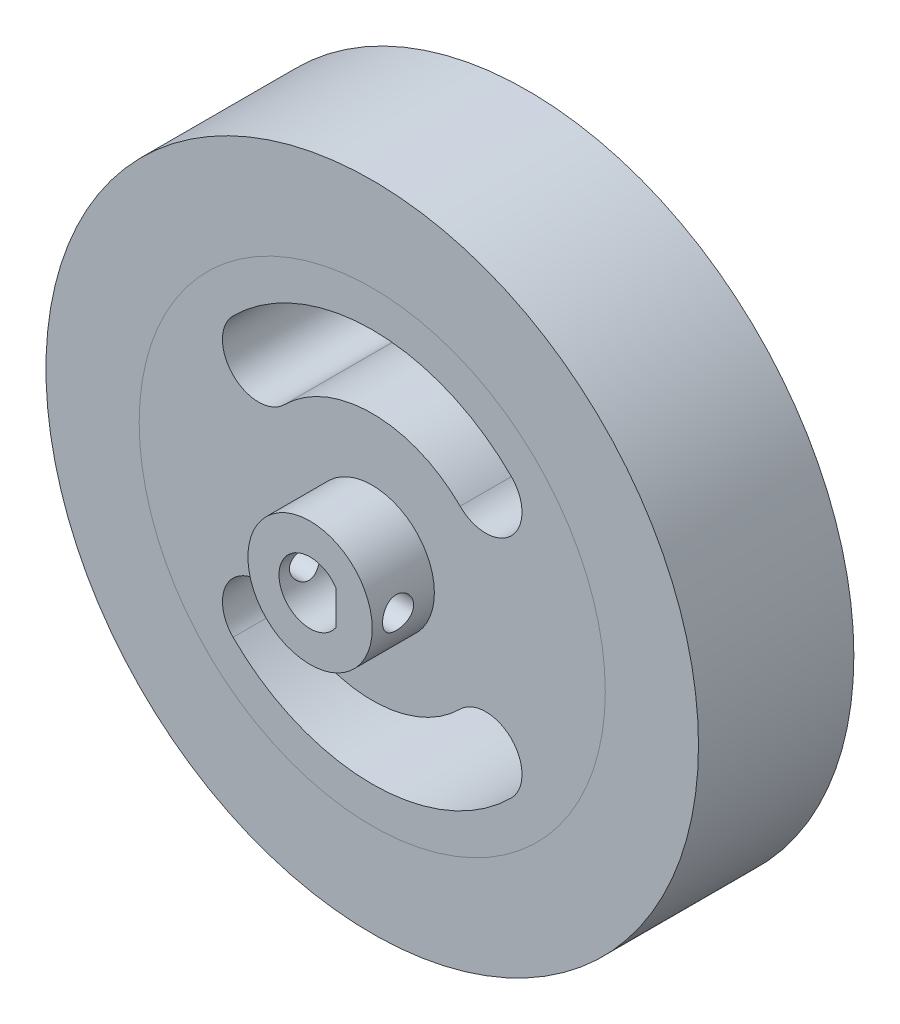
ISO-10303-21;
HEADER;
FILE_DESCRIPTION(('STEP AP214'),'2;1');
FILE_NAME('part.step','',(''),(''),'','','');
FILE_SCHEMA(('AUTOMOTIVE_DESIGN { 1 0 10303 214 1 1 1 1 }'));
ENDSEC;
DATA;
#1=APPLICATION_CONTEXT('core data for automotive mechanical design processes');
#2=APPLICATION_PROTOCOL_DEFINITION('international standard','automotive_design',2000,#1);
#3=PRODUCT_CONTEXT('',#1,'mechanical');
#4=PRODUCT('Part','Part','',(#3));
#5=PRODUCT_RELATED_PRODUCT_CATEGORY('part','',(#4));
#6=PRODUCT_DEFINITION_FORMATION('','',#4);
#7=PRODUCT_DEFINITION_CONTEXT('part definition',#1,'design');
#8=PRODUCT_DEFINITION('design','',#6,#7);
#9=PRODUCT_DEFINITION_SHAPE('','',#8);
#10=(LENGTH_UNIT() NAMED_UNIT(*) SI_UNIT(.MILLI.,.METRE.));
#11=(NAMED_UNIT(*) PLANE_ANGLE_UNIT() SI_UNIT($,.RADIAN.));
#12=(NAMED_UNIT(*) SI_UNIT($,.STERADIAN.) SOLID_ANGLE_UNIT());
#13=UNCERTAINTY_MEASURE_WITH_UNIT(LENGTH_MEASURE(1.E-05),#10,'distance_accuracy_value','');
#14=(GEOMETRIC_REPRESENTATION_CONTEXT(3) GLOBAL_UNCERTAINTY_ASSIGNED_CONTEXT((#13)) GLOBAL_UNIT_ASSIGNED_CONTEXT((#10,
#11,#12)) REPRESENTATION_CONTEXT('',''));
#15=CARTESIAN_POINT('',(0.,0.,0.));
#16=DIRECTION('',(0.,0.,1.));
#17=DIRECTION('',(1.,0.,0.));
#18=AXIS2_PLACEMENT_3D('',#15,#16,#17);
#19=CARTESIAN_POINT('',(0.,0.,15.));
#20=DIRECTION('',(0.,0.,1.));
#21=DIRECTION('',(1.,0.,0.));
#22=AXIS2_PLACEMENT_3D('',#19,#20,#21);
#23=PLANE('',#22);
#24=CARTESIAN_POINT('',(0.,0.,15.));
#25=DIRECTION('',(0.,0.,1.));
#26=DIRECTION('',(1.,0.,0.));
#27=AXIS2_PLACEMENT_3D('',#24,#25,#26);
#28=CIRCLE('',#27,31.5);
#29=CARTESIAN_POINT('',(31.5,0.,15.));
#30=VERTEX_POINT('',#29);
#31=EDGE_CURVE('E244',#30,#30,#28,.T.);
#32=ORIENTED_EDGE('',*,*,#31,.T.);
#33=EDGE_LOOP('',(#32));
#34=FACE_BOUND('',#33,.T.);
#35=CARTESIAN_POINT('',(0.,0.,15.));
#36=DIRECTION('',(0.,0.,1.));
#37=DIRECTION('',(1.,0.,0.));
#38=AXIS2_PLACEMENT_3D('',#35,#36,#37);
#39=CIRCLE('',#38,22.5);
#40=CARTESIAN_POINT('',(22.5,0.,15.));
#41=VERTEX_POINT('',#40);
#42=EDGE_CURVE('E11',#41,#41,#39,.F.);
#43=ORIENTED_EDGE('',*,*,#42,.T.);
#44=EDGE_LOOP('',(#43));
#45=FACE_BOUND('',#44,.T.);
#46=ADVANCED_FACE('F38',(#34,#45),#23,.T.);
#47=CARTESIAN_POINT('',(0.,0.,0.));
#48=DIRECTION('',(0.,0.,1.));
#49=DIRECTION('',(1.,0.,0.));
#50=AXIS2_PLACEMENT_3D('',#47,#48,#49);
#51=PLANE('',#50);
#52=CARTESIAN_POINT('',(0.,0.,0.));
#53=DIRECTION('',(0.,0.,1.));
#54=DIRECTION('',(1.,0.,0.));
#55=AXIS2_PLACEMENT_3D('',#52,#53,#54);
#56=CIRCLE('',#55,31.5);
#57=CARTESIAN_POINT('',(31.5,0.,0.));
#58=VERTEX_POINT('',#57);
#59=EDGE_CURVE('E262',#58,#58,#56,.T.);
#60=ORIENTED_EDGE('',*,*,#59,.F.);
#61=EDGE_LOOP('',(#60));
#62=FACE_BOUND('',#61,.T.);
#63=CARTESIAN_POINT('',(0.,0.,0.));
#64=DIRECTION('',(0.,0.,1.));
#65=DIRECTION('',(1.,0.,0.));
#66=AXIS2_PLACEMENT_3D('',#63,#64,#65);
#67=CIRCLE('',#66,22.5);
#68=CARTESIAN_POINT('',(22.5,0.,0.));
#69=VERTEX_POINT('',#68);
#70=EDGE_CURVE('E48',#69,#69,#67,.F.);
#71=ORIENTED_EDGE('',*,*,#70,.F.);
#72=EDGE_LOOP('',(#71));
#73=FACE_BOUND('',#72,.T.);
#74=ADVANCED_FACE('F228',(#62,#73),#51,.F.);
#75=CARTESIAN_POINT('',(10.9601551083915,10.9601551083915,15.));
#76=DIRECTION('',(0.,0.,1.));
#77=DIRECTION('',(1.,0.,0.));
#78=AXIS2_PLACEMENT_3D('',#75,#76,#77);
#79=CIRCLE('',#78,3.5);
#80=CARTESIAN_POINT('',(8.48528137423857,8.48528137423857,15.));
#81=VERTEX_POINT('',#80);
#82=CARTESIAN_POINT('',(13.4350288425444,13.4350288425444,15.));
#83=VERTEX_POINT('',#82);
#84=EDGE_CURVE('E122',#81,#83,#79,.T.);
#85=ORIENTED_EDGE('',*,*,#84,.F.);
#86=CARTESIAN_POINT('',(0.,0.,15.));
#87=DIRECTION('',(0.,0.,1.));
#88=DIRECTION('',(1.,0.,0.));
#89=AXIS2_PLACEMENT_3D('',#86,#87,#88);
#90=CIRCLE('',#89,12.);
#91=CARTESIAN_POINT('',(-8.4852813742383,8.48528137423884,15.));
#92=VERTEX_POINT('',#91);
#93=EDGE_CURVE('E183',#92,#81,#90,.F.);
#94=ORIENTED_EDGE('',*,*,#93,.F.);
#95=CARTESIAN_POINT('',(-10.9601551083911,10.9601551083918,15.));
#96=DIRECTION('',(0.,0.,1.));
#97=DIRECTION('',(1.,0.,0.));
#98=AXIS2_PLACEMENT_3D('',#95,#96,#97);
#99=CIRCLE('',#98,3.5);
#100=CARTESIAN_POINT('',(-13.435028842544,13.4350288425448,15.));
#101=VERTEX_POINT('',#100);
#102=EDGE_CURVE('E181',#101,#92,#99,.T.);
#103=ORIENTED_EDGE('',*,*,#102,.F.);
#104=CARTESIAN_POINT('',(0.,0.,15.));
#105=DIRECTION('',(0.,0.,1.));
#106=DIRECTION('',(1.,0.,0.));
#107=AXIS2_PLACEMENT_3D('',#104,#105,#106);
#108=CIRCLE('',#107,19.);
#109=EDGE_CURVE('E179',#83,#101,#108,.T.);
#110=ORIENTED_EDGE('',*,*,#109,.F.);
#111=EDGE_LOOP('',(#85,#94,#103,#110));
#112=FACE_BOUND('',#111,.T.);
#113=CARTESIAN_POINT('',(0.,0.,15.));
#114=DIRECTION('',(0.,0.,1.));
#115=DIRECTION('',(1.,0.,0.));
#116=AXIS2_PLACEMENT_3D('',#113,#114,#115);
#117=CIRCLE('',#116,12.);
#118=CARTESIAN_POINT('',(8.48528137423854,-8.4852813742386,15.));
#119=VERTEX_POINT('',#118);
#120=CARTESIAN_POINT('',(-8.48528137423833,-8.48528137423881,15.));
#121=VERTEX_POINT('',#120);
#122=EDGE_CURVE('E177',#119,#121,#117,.F.);
#123=ORIENTED_EDGE('',*,*,#122,.F.);
#124=CARTESIAN_POINT('',(10.9601551083915,-10.9601551083915,15.));
#125=DIRECTION('',(0.,0.,1.));
#126=DIRECTION('',(1.,0.,0.));
#127=AXIS2_PLACEMENT_3D('',#124,#125,#126);
#128=CIRCLE('',#127,3.5);
#129=CARTESIAN_POINT('',(13.4350288425444,-13.4350288425444,15.));
#130=VERTEX_POINT('',#129);
#131=EDGE_CURVE('E175',#130,#119,#128,.T.);
#132=ORIENTED_EDGE('',*,*,#131,.F.);
#133=CARTESIAN_POINT('',(0.,0.,15.));
#134=DIRECTION('',(0.,0.,1.));
#135=DIRECTION('',(1.,0.,0.));
#136=AXIS2_PLACEMENT_3D('',#133,#134,#135);
#137=CIRCLE('',#136,19.);
#138=CARTESIAN_POINT('',(-13.435028842544,-13.4350288425448,15.));
#139=VERTEX_POINT('',#138);
#140=EDGE_CURVE('E173',#139,#130,#137,.T.);
#141=ORIENTED_EDGE('',*,*,#140,.F.);
#142=CARTESIAN_POINT('',(-10.9601551083912,-10.9601551083918,15.));
#143=DIRECTION('',(0.,0.,1.));
#144=DIRECTION('',(1.,0.,0.));
#145=AXIS2_PLACEMENT_3D('',#142,#143,#144);
#146=CIRCLE('',#145,3.5);
#147=EDGE_CURVE('E149',#121,#139,#146,.T.);
#148=ORIENTED_EDGE('',*,*,#147,.F.);
#149=EDGE_LOOP('',(#123,#132,#141,#148));
#150=FACE_BOUND('',#149,.T.);
#151=ORIENTED_EDGE('',*,*,#42,.F.);
#152=EDGE_LOOP('',(#151));
#153=FACE_BOUND('',#152,.T.);
#154=CARTESIAN_POINT('',(0.,0.,15.));
#155=DIRECTION('',(0.,0.,1.));
#156=DIRECTION('',(1.,0.,0.));
#157=AXIS2_PLACEMENT_3D('',#154,#155,#156);
#158=CIRCLE('',#157,6.);
#159=CARTESIAN_POINT('',(6.,0.,15.));
#160=VERTEX_POINT('',#159);
#161=EDGE_CURVE('E250',#160,#160,#158,.T.);
#162=ORIENTED_EDGE('',*,*,#161,.F.);
#163=EDGE_LOOP('',(#162));
#164=FACE_BOUND('',#163,.T.);
#165=ADVANCED_FACE('F226',(#112,#150,#153,#164),#23,.T.);
#166=CARTESIAN_POINT('',(0.,0.,15.));
#167=DIRECTION('',(0.,0.,-1.));
#168=DIRECTION('',(-1.,0.,0.));
#169=AXIS2_PLACEMENT_3D('',#166,#167,#168);
#170=CYLINDRICAL_SURFACE('',#169,31.5);
#171=ORIENTED_EDGE('',*,*,#31,.F.);
#172=EDGE_LOOP('',(#171));
#173=FACE_BOUND('',#172,.T.);
#174=ORIENTED_EDGE('',*,*,#59,.T.);
#175=EDGE_LOOP('',(#174));
#176=FACE_BOUND('',#175,.T.);
#177=ADVANCED_FACE('F40',(#173,#176),#170,.T.);
#178=CARTESIAN_POINT('',(0.,0.,0.));
#179=DIRECTION('',(0.,0.,-1.));
#180=DIRECTION('',(1.,0.,0.));
#181=AXIS2_PLACEMENT_3D('',#178,#179,#180);
#182=CIRCLE('',#181,12.);
#183=CARTESIAN_POINT('',(-8.4852813742383,8.48528137423884,0.));
#184=VERTEX_POINT('',#183);
#185=CARTESIAN_POINT('',(8.48528137423857,8.48528137423857,0.));
#186=VERTEX_POINT('',#185);
#187=EDGE_CURVE('E125',#184,#186,#182,.T.);
#188=ORIENTED_EDGE('',*,*,#187,.T.);
#189=CARTESIAN_POINT('',(10.9601551083915,10.9601551083915,0.));
#190=DIRECTION('',(0.,0.,1.));
#191=DIRECTION('',(1.,0.,0.));
#192=AXIS2_PLACEMENT_3D('',#189,#190,#191);
#193=CIRCLE('',#192,3.5);
#194=CARTESIAN_POINT('',(13.4350288425444,13.4350288425444,0.));
#195=VERTEX_POINT('',#194);
#196=EDGE_CURVE('E119',#186,#195,#193,.T.);
#197=ORIENTED_EDGE('',*,*,#196,.T.);
#198=CARTESIAN_POINT('',(0.,0.,0.));
#199=DIRECTION('',(0.,0.,1.));
#200=DIRECTION('',(1.,0.,0.));
#201=AXIS2_PLACEMENT_3D('',#198,#199,#200);
#202=CIRCLE('',#201,19.);
#203=CARTESIAN_POINT('',(-13.435028842544,13.4350288425448,0.));
#204=VERTEX_POINT('',#203);
#205=EDGE_CURVE('E129',#195,#204,#202,.T.);
#206=ORIENTED_EDGE('',*,*,#205,.T.);
#207=CARTESIAN_POINT('',(-10.9601551083911,10.9601551083918,0.));
#208=DIRECTION('',(0.,0.,1.));
#209=DIRECTION('',(1.,0.,0.));
#210=AXIS2_PLACEMENT_3D('',#207,#208,#209);
#211=CIRCLE('',#210,3.5);
#212=EDGE_CURVE('E134',#204,#184,#211,.T.);
#213=ORIENTED_EDGE('',*,*,#212,.T.);
#214=EDGE_LOOP('',(#188,#197,#206,#213));
#215=FACE_BOUND('',#214,.T.);
#216=CARTESIAN_POINT('',(10.9601551083915,-10.9601551083915,0.));
#217=DIRECTION('',(0.,0.,1.));
#218=DIRECTION('',(-1.,0.,0.));
#219=AXIS2_PLACEMENT_3D('',#216,#217,#218);
#220=CIRCLE('',#219,3.5);
#221=CARTESIAN_POINT('',(13.4350288425444,-13.4350288425444,0.));
#222=VERTEX_POINT('',#221);
#223=CARTESIAN_POINT('',(8.48528137423854,-8.4852813742386,0.));
#224=VERTEX_POINT('',#223);
#225=EDGE_CURVE('E163',#222,#224,#220,.T.);
#226=ORIENTED_EDGE('',*,*,#225,.T.);
#227=CARTESIAN_POINT('',(0.,0.,0.));
#228=DIRECTION('',(0.,0.,-1.));
#229=DIRECTION('',(-1.,0.,0.));
#230=AXIS2_PLACEMENT_3D('',#227,#228,#229);
#231=CIRCLE('',#230,12.);
#232=CARTESIAN_POINT('',(-8.48528137423833,-8.48528137423881,0.));
#233=VERTEX_POINT('',#232);
#234=EDGE_CURVE('E154',#224,#233,#231,.T.);
#235=ORIENTED_EDGE('',*,*,#234,.T.);
#236=CARTESIAN_POINT('',(-10.9601551083912,-10.9601551083918,0.));
#237=DIRECTION('',(0.,0.,1.));
#238=DIRECTION('',(-1.,0.,0.));
#239=AXIS2_PLACEMENT_3D('',#236,#237,#238);
#240=CIRCLE('',#239,3.5);
#241=CARTESIAN_POINT('',(-13.435028842544,-13.4350288425448,0.));
#242=VERTEX_POINT('',#241);
#243=EDGE_CURVE('E157',#233,#242,#240,.T.);
#244=ORIENTED_EDGE('',*,*,#243,.T.);
#245=CARTESIAN_POINT('',(0.,0.,0.));
#246=DIRECTION('',(0.,0.,1.));
#247=DIRECTION('',(-1.,0.,0.));
#248=AXIS2_PLACEMENT_3D('',#245,#246,#247);
#249=CIRCLE('',#248,19.);
#250=EDGE_CURVE('E160',#242,#222,#249,.T.);
#251=ORIENTED_EDGE('',*,*,#250,.T.);
#252=EDGE_LOOP('',(#226,#235,#244,#251));
#253=FACE_BOUND('',#252,.T.);
#254=ORIENTED_EDGE('',*,*,#70,.T.);
#255=EDGE_LOOP('',(#254));
#256=FACE_BOUND('',#255,.T.);
#257=CARTESIAN_POINT('',(0.,0.,0.));
#258=DIRECTION('',(0.,0.,-1.));
#259=DIRECTION('',(-1.,0.,0.));
#260=AXIS2_PLACEMENT_3D('',#257,#258,#259);
#261=CIRCLE('',#260,3.);
#262=CARTESIAN_POINT('',(2.5,-1.6583123951777,0.));
#263=VERTEX_POINT('',#262);
#264=CARTESIAN_POINT('',(2.5,1.6583123951777,0.));
#265=VERTEX_POINT('',#264);
#266=EDGE_CURVE('E256',#263,#265,#261,.T.);
#267=ORIENTED_EDGE('',*,*,#266,.F.);
#268=DIRECTION('',(0.,1.,0.));
#269=VECTOR('',#268,1.);
#270=CARTESIAN_POINT('',(2.5,1.6583123951777,0.));
#271=LINE('',#270,#269);
#272=EDGE_CURVE('E258',#263,#265,#271,.T.);
#273=ORIENTED_EDGE('',*,*,#272,.T.);
#274=EDGE_LOOP('',(#267,#273));
#275=FACE_BOUND('',#274,.T.);
#276=ADVANCED_FACE('F136',(#215,#253,#256,#275),#51,.F.);
#277=CARTESIAN_POINT('',(0.,0.,15.));
#278=DIRECTION('',(0.,0.,-1.));
#279=DIRECTION('',(-1.,0.,0.));
#280=AXIS2_PLACEMENT_3D('',#277,#278,#279);
#281=CYLINDRICAL_SURFACE('',#280,3.);
#282=CARTESIAN_POINT('',(-3.,0.,17.));
#283=CARTESIAN_POINT('',(-2.99999570107562,-0.0788579444268503,17.0000049534758));
#284=CARTESIAN_POINT('',(-2.99685736529635,-0.157809899546344,17.0062551096816));
#285=CARTESIAN_POINT('',(-2.98461234055736,-0.313380352903344,17.0309793205123));
#286=CARTESIAN_POINT('',(-2.97549431743379,-0.389994130070444,17.0494765894967));
#287=CARTESIAN_POINT('',(-2.95224419105063,-0.538400317320673,17.0977907129249));
#288=CARTESIAN_POINT('',(-2.93813158766306,-0.610210204408719,17.127563576372));
#289=CARTESIAN_POINT('',(-2.90618664773642,-0.747708925209897,17.1973559320475));
#290=CARTESIAN_POINT('',(-2.88835460450288,-0.813398240985088,17.2373746163733));
#291=CARTESIAN_POINT('',(-2.84934387387093,-0.941261726642863,17.3292758742279));
#292=CARTESIAN_POINT('',(-2.82802798691306,-1.00298281668316,17.3817297188595));
#293=CARTESIAN_POINT('',(-2.78489955370115,-1.11716916730047,17.4957822188706));
#294=CARTESIAN_POINT('',(-2.76308664313552,-1.16962737466015,17.5573877776587));
#295=CARTESIAN_POINT('',(-2.71948426796021,-1.26787800067542,17.6937250242851));
#296=CARTESIAN_POINT('',(-2.69782780455198,-1.31283800332745,17.7691041475189));
#297=CARTESIAN_POINT('',(-2.65928968158481,-1.38925234033604,17.9275510039793));
#298=CARTESIAN_POINT('',(-2.64240461410484,-1.4207163224495,18.0106131930841));
#299=CARTESIAN_POINT('',(-2.61686800556713,-1.46719866328288,18.1769976581329));
#300=CARTESIAN_POINT('',(-2.6077840737557,-1.48308878562066,18.2600066781011));
#301=CARTESIAN_POINT('',(-2.59772834922792,-1.50064048996327,18.4279682566692));
#302=CARTESIAN_POINT('',(-2.59674854014932,-1.50231613255961,18.5129188113067));
#303=CARTESIAN_POINT('',(-2.60266395385873,-1.49203093075844,18.6714290364731));
#304=CARTESIAN_POINT('',(-2.6086314549302,-1.48167683930523,18.7451360468346));
#305=CARTESIAN_POINT('',(-2.62614343100775,-1.4504097735854,18.8895828640596));
#306=CARTESIAN_POINT('',(-2.63768968247664,-1.42949343584648,18.960321717958));
#307=CARTESIAN_POINT('',(-2.66531214619112,-1.37731467057901,19.0988436988485));
#308=CARTESIAN_POINT('',(-2.68148760995998,-1.34582260067399,19.1665195981787));
#309=CARTESIAN_POINT('',(-2.71655106422106,-1.27356253150201,19.295951438885));
#310=CARTESIAN_POINT('',(-2.73544027170286,-1.2327903657187,19.3577047034001));
#311=CARTESIAN_POINT('',(-2.77669736854929,-1.13709908236918,19.4817818791148));
#312=CARTESIAN_POINT('',(-2.79920265355119,-1.08104168755392,19.5431853103642));
#313=CARTESIAN_POINT('',(-2.84321434950611,-0.959333368112062,19.6561031278864));
#314=CARTESIAN_POINT('',(-2.86472027938201,-0.893677884861431,19.7076127880508));
#315=CARTESIAN_POINT('',(-2.90552980924446,-0.750774758747775,19.8015284915446));
#316=CARTESIAN_POINT('',(-2.92468476243011,-0.673130387399114,19.8434007086686));
#317=CARTESIAN_POINT('',(-2.95736821681863,-0.510699323233196,19.9131455435645));
#318=CARTESIAN_POINT('',(-2.9709011841533,-0.425918364397915,19.9410292775228));
#319=CARTESIAN_POINT('',(-2.98986500612153,-0.259149737491055,19.979713105575));
#320=CARTESIAN_POINT('',(-2.99587407451965,-0.17751229582249,19.9917368536202));
#321=CARTESIAN_POINT('',(-3.00109520188655,-0.0131693999240284,20.0021970967017));
#322=CARTESIAN_POINT('',(-3.00031048081978,0.0695355298048622,20.0006400284592));
#323=CARTESIAN_POINT('',(-2.99236788380152,0.226849457978979,19.9846899673719));
#324=CARTESIAN_POINT('',(-2.98570868532253,0.301589112074894,19.971301200905));
#325=CARTESIAN_POINT('',(-2.9673325697226,0.44761033845291,19.9336428921573));
#326=CARTESIAN_POINT('',(-2.95561509501618,0.51889152853663,19.9093721503198));
#327=CARTESIAN_POINT('',(-2.92776377120382,0.658332912674359,19.8500023003505));
#328=CARTESIAN_POINT('',(-2.91151322654446,0.726345595508706,19.8146134248256));
#329=CARTESIAN_POINT('',(-2.87615961476126,0.855692042548907,19.7343386965301));
#330=CARTESIAN_POINT('',(-2.85705533350407,0.917022944664887,19.6894487981069));
#331=CARTESIAN_POINT('',(-2.81562332004297,1.03765153393382,19.5863593620039));
#332=CARTESIAN_POINT('',(-2.79316327265249,1.09615811672854,19.5272856973323));
#333=CARTESIAN_POINT('',(-2.7489358741323,1.20278448167828,19.4001122730834));
#334=CARTESIAN_POINT('',(-2.72716901100071,1.25089707856781,19.3320063217281));
#335=CARTESIAN_POINT('',(-2.68576788309734,1.33756187171853,19.1845345187405));
#336=CARTESIAN_POINT('',(-2.66628794383591,1.37553824370037,19.1047831008583));
#337=CARTESIAN_POINT('',(-2.63361108441202,1.43712423890206,18.9387348986376));
#338=CARTESIAN_POINT('',(-2.62040607332625,1.46075237380053,18.8524467102997));
#339=CARTESIAN_POINT('',(-2.60342251538703,1.49079253120031,18.6846346656729));
#340=CARTESIAN_POINT('',(-2.59886075197597,1.49863949460818,18.6034486198471));
#341=CARTESIAN_POINT('',(-2.59748031962405,1.5010337315643,18.4408293992532));
#342=CARTESIAN_POINT('',(-2.60065829439585,1.49558676993486,18.3593963468932));
#343=CARTESIAN_POINT('',(-2.61356793076615,1.47288918838997,18.2067747476998));
#344=CARTESIAN_POINT('',(-2.62264641723988,1.45681247151455,18.1353492947829));
#345=CARTESIAN_POINT('',(-2.64556524281479,1.41476303733662,17.9962878208635));
#346=CARTESIAN_POINT('',(-2.65940711354503,1.38878713673988,17.928653026862));
#347=CARTESIAN_POINT('',(-2.69142795546803,1.32572361795085,17.7940627235202));
#348=CARTESIAN_POINT('',(-2.70983583593881,1.28800670672355,17.7274581472565));
#349=CARTESIAN_POINT('',(-2.74852997452291,1.20322645745609,17.6010881957281));
#350=CARTESIAN_POINT('',(-2.76881720693416,1.15615825686234,17.5413264042183));
#351=CARTESIAN_POINT('',(-2.81193484737138,1.04730498999206,17.422787026468));
#352=CARTESIAN_POINT('',(-2.83477474959942,0.984426634495894,17.3650113464746));
#353=CARTESIAN_POINT('',(-2.87816628389896,0.849232209349799,17.2606055248471));
#354=CARTESIAN_POINT('',(-2.89871667939293,0.776911084957799,17.2139813907951));
#355=CARTESIAN_POINT('',(-2.93547014349806,0.623897395174421,17.1331454559319));
#356=CARTESIAN_POINT('',(-2.95164144740899,0.543149255665098,17.0990237461453));
#357=CARTESIAN_POINT('',(-2.9775201194848,0.376113151707131,17.0452877483639));
#358=CARTESIAN_POINT('',(-2.98724585044602,0.289841699383651,17.0256322297914));
#359=CARTESIAN_POINT('',(-2.99543192870217,0.168902919736344,17.0091538833714));
#360=CARTESIAN_POINT('',(-2.99714048010376,0.135242819162348,17.0057260387005));
#361=CARTESIAN_POINT('',(-2.99942545465223,0.0677275977076379,17.0011480017289));
#362=CARTESIAN_POINT('',(-3.00000184655071,0.033872471469943,16.9999978722947));
#363=CARTESIAN_POINT('',(-3.,0.,17.));
#364=B_SPLINE_CURVE_WITH_KNOTS('',3,(#282,#283,#284,#285,#286,#287,#288,#289,#290,#291,#292,
#293,#294,#295,#296,#297,#298,#299,#300,#301,#302,#303,#304,#305,#306,#307,#308,#309,#310,#311,
#312,#313,#314,#315,#316,#317,#318,#319,#320,#321,#322,#323,#324,#325,#326,#327,#328,#329,#330,
#331,#332,#333,#334,#335,#336,#337,#338,#339,#340,#341,#342,#343,#344,#345,#346,#347,#348,#349,
#350,#351,#352,#353,#354,#355,#356,#357,#358,#359,#360,#361,#362,#363),.UNSPECIFIED.,.T.,.F.,(4,
2,2,2,2,2,2,2,2,2,2,2,2,2,2,2,2,2,2,2,2,2,2,2,2,2,2,2,2,2,2,2,2,2,2,2,2,2,2,2,4),(0.,
0.236436386130439,0.473322224563797,0.709293233238447,0.945245640872351,1.19547263807713,
1.44588935648105,1.71572589646129,1.98536921847421,2.23887018210344,2.49212035993531,
2.71508568613981,2.93812205888518,3.16635360252731,3.39468781890332,3.65197412000818,
3.9093830189803,4.17874533321661,4.4478932536842,4.69474935707019,4.94148846767214,
5.16910359759183,5.39674382446397,5.63089284041848,5.86514176122509,6.12239415966628,
6.37982382923148,6.64972023242589,6.91926767918176,7.1629396125457,7.40650589797017,
7.62686895373284,7.84730293182527,8.08254685170431,8.31791341715446,8.58187864135757,
8.84598575071869,9.1119602049529,9.37717362931724,9.47872920200876,9.58028757766599),.UNSPECIFIED.);
#365=CARTESIAN_POINT('',(-3.,0.,17.));
#366=VERTEX_POINT('',#365);
#367=EDGE_CURVE('E213',#366,#366,#364,.T.);
#368=ORIENTED_EDGE('',*,*,#367,.T.);
#369=EDGE_LOOP('',(#368));
#370=FACE_BOUND('',#369,.T.);
#371=ORIENTED_EDGE('',*,*,#266,.T.);
#372=DIRECTION('',(0.,0.,1.));
#373=VECTOR('',#372,1.);
#374=CARTESIAN_POINT('',(2.5,1.6583123951777,-3.35410196624969));
#375=LINE('',#374,#373);
#376=CARTESIAN_POINT('',(2.5,1.6583123951777,21.));
#377=VERTEX_POINT('',#376);
#378=EDGE_CURVE('E285',#265,#377,#375,.T.);
#379=ORIENTED_EDGE('',*,*,#378,.T.);
#380=CARTESIAN_POINT('',(0.,0.,21.));
#381=DIRECTION('',(0.,0.,1.));
#382=DIRECTION('',(1.,0.,0.));
#383=AXIS2_PLACEMENT_3D('',#380,#381,#382);
#384=CIRCLE('',#383,3.);
#385=CARTESIAN_POINT('',(2.5,-1.6583123951777,21.));
#386=VERTEX_POINT('',#385);
#387=EDGE_CURVE('E253',#377,#386,#384,.T.);
#388=ORIENTED_EDGE('',*,*,#387,.T.);
#389=DIRECTION('',(0.,0.,1.));
#390=VECTOR('',#389,1.);
#391=CARTESIAN_POINT('',(2.5,-1.6583123951777,-3.35410196624969));
#392=LINE('',#391,#390);
#393=EDGE_CURVE('E283',#263,#386,#392,.T.);
#394=ORIENTED_EDGE('',*,*,#393,.F.);
#395=EDGE_LOOP('',(#371,#379,#388,#394));
#396=FACE_BOUND('',#395,.T.);
#397=ADVANCED_FACE('F220',(#370,#396),#281,.F.);
#398=CARTESIAN_POINT('',(0.,0.,21.));
#399=DIRECTION('',(0.,0.,1.));
#400=DIRECTION('',(1.,0.,0.));
#401=AXIS2_PLACEMENT_3D('',#398,#399,#400);
#402=PLANE('',#401);
#403=CARTESIAN_POINT('',(0.,0.,21.));
#404=DIRECTION('',(0.,0.,1.));
#405=DIRECTION('',(1.,0.,0.));
#406=AXIS2_PLACEMENT_3D('',#403,#404,#405);
#407=CIRCLE('',#406,6.);
#408=CARTESIAN_POINT('',(6.,0.,21.));
#409=VERTEX_POINT('',#408);
#410=EDGE_CURVE('E252',#409,#409,#407,.T.);
#411=ORIENTED_EDGE('',*,*,#410,.T.);
#412=EDGE_LOOP('',(#411));
#413=FACE_BOUND('',#412,.T.);
#414=ORIENTED_EDGE('',*,*,#387,.F.);
#415=DIRECTION('',(0.,-1.,0.));
#416=VECTOR('',#415,1.);
#417=CARTESIAN_POINT('',(2.5,1.6583123951777,21.));
#418=LINE('',#417,#416);
#419=EDGE_CURVE('E218',#377,#386,#418,.T.);
#420=ORIENTED_EDGE('',*,*,#419,.T.);
#421=EDGE_LOOP('',(#414,#420));
#422=FACE_BOUND('',#421,.T.);
#423=ADVANCED_FACE('F224',(#413,#422),#402,.T.);
#424=CARTESIAN_POINT('',(0.,0.,21.));
#425=DIRECTION('',(0.,0.,-1.));
#426=DIRECTION('',(-1.,0.,0.));
#427=AXIS2_PLACEMENT_3D('',#424,#425,#426);
#428=CYLINDRICAL_SURFACE('',#427,6.);
#429=CARTESIAN_POINT('',(-6.,0.,20.));
#430=CARTESIAN_POINT('',(-5.99999859868013,-0.082876088669731,19.9999976742618));
#431=CARTESIAN_POINT('',(-5.99826578131828,-0.165778157830763,19.9931084492262));
#432=CARTESIAN_POINT('',(-5.99152113829892,-0.329206323770532,19.965774848693));
#433=CARTESIAN_POINT('',(-5.98650745419968,-0.409731046870739,19.9453227904622));
#434=CARTESIAN_POINT('',(-5.9737562633204,-0.566020872182577,19.8915607465379));
#435=CARTESIAN_POINT('',(-5.96602202842087,-0.641791563430003,19.8582662012847));
#436=CARTESIAN_POINT('',(-5.94865343807593,-0.786672131904426,19.7798186099552));
#437=CARTESIAN_POINT('',(-5.9390190185405,-0.855781784348759,19.7346651638811));
#438=CARTESIAN_POINT('',(-5.91867413591801,-0.98680192730092,19.6327992103458));
#439=CARTESIAN_POINT('',(-5.90794707148533,-1.04855569006107,19.5758884250408));
#440=CARTESIAN_POINT('',(-5.8867362011753,-1.1617489272033,19.4525477950911));
#441=CARTESIAN_POINT('',(-5.87625242288348,-1.21318723694913,19.3861168770535));
#442=CARTESIAN_POINT('',(-5.8565477569971,-1.30502654279903,19.2444047732626));
#443=CARTESIAN_POINT('',(-5.84734794470605,-1.34525221592536,19.1690067691896));
#444=CARTESIAN_POINT('',(-5.83149494812223,-1.41239690855053,19.0122515883416));
#445=CARTESIAN_POINT('',(-5.82484135672789,-1.43931805543933,18.9308953666742));
#446=CARTESIAN_POINT('',(-5.81500476717551,-1.47855483680429,18.7662565017975));
#447=CARTESIAN_POINT('',(-5.81175491075426,-1.49115226833334,18.6830451039502));
#448=CARTESIAN_POINT('',(-5.80889362537741,-1.50226177506785,18.515631430986));
#449=CARTESIAN_POINT('',(-5.80928160448644,-1.50077614181798,18.4314293193014));
#450=CARTESIAN_POINT('',(-5.81359205496618,-1.48398652463928,18.2665841922555));
#451=CARTESIAN_POINT('',(-5.81742863001879,-1.46901834019052,18.1859043785349));
#452=CARTESIAN_POINT('',(-5.82806709676484,-1.42622418690311,18.0282389490887));
#453=CARTESIAN_POINT('',(-5.83486919970696,-1.39839730206942,17.951253596971));
#454=CARTESIAN_POINT('',(-5.85075113904187,-1.33038947793715,17.8022619837479));
#455=CARTESIAN_POINT('',(-5.85985327469421,-1.29008666723291,17.7303138282104));
#456=CARTESIAN_POINT('',(-5.87929710846386,-1.19835627601496,17.5940812902432));
#457=CARTESIAN_POINT('',(-5.88963902334735,-1.14692674880884,17.5297982519327));
#458=CARTESIAN_POINT('',(-5.91075880539781,-1.03266342468122,17.4087963843056));
#459=CARTESIAN_POINT('',(-5.92154069477971,-0.969546258165863,17.3523455099387));
#460=CARTESIAN_POINT('',(-5.94205965578786,-0.834611917503703,17.2507787575361));
#461=CARTESIAN_POINT('',(-5.95179669549415,-0.762794477707946,17.2056632257364));
#462=CARTESIAN_POINT('',(-5.96917732094183,-0.612115888681394,17.1279494137756));
#463=CARTESIAN_POINT('',(-5.97681360127725,-0.533231393208626,17.0953946597456));
#464=CARTESIAN_POINT('',(-5.98907916991419,-0.370876008142885,17.0440826942904));
#465=CARTESIAN_POINT('',(-5.99370903339281,-0.287405999150486,17.0253228435819));
#466=CARTESIAN_POINT('',(-5.99935499271375,-0.120539970390028,17.0025424344412));
#467=CARTESIAN_POINT('',(-6.00046053508279,-0.037196719988211,16.9981569739247));
#468=CARTESIAN_POINT('',(-5.99918804814451,0.129032874801507,17.0032490020555));
#469=CARTESIAN_POINT('',(-5.99681033241847,0.211919259644594,17.0127252427991));
#470=CARTESIAN_POINT('',(-5.98889581127357,0.373614268776491,17.0449709083914));
#471=CARTESIAN_POINT('',(-5.98340634185811,0.452465118968754,17.067541263477));
#472=CARTESIAN_POINT('',(-5.96988706634134,0.60525729245251,17.1251070840284));
#473=CARTESIAN_POINT('',(-5.96185700369892,0.679198119032633,17.1601038043132));
#474=CARTESIAN_POINT('',(-5.9439330792631,0.821523134429846,17.2422361288747));
#475=CARTESIAN_POINT('',(-5.93400867366932,0.88978544183583,17.2895761123968));
#476=CARTESIAN_POINT('',(-5.91344509187419,1.01752661364325,17.394789908797));
#477=CARTESIAN_POINT('',(-5.90280579251705,1.07700395897301,17.4526655396169));
#478=CARTESIAN_POINT('',(-5.88168956960771,1.18699056807273,17.5790019608445));
#479=CARTESIAN_POINT('',(-5.87122304187281,1.23724386762203,17.6476877030024));
#480=CARTESIAN_POINT('',(-5.85192878377239,1.3255107590127,17.7927326344657));
#481=CARTESIAN_POINT('',(-5.84310098067026,1.36352489415794,17.8690914829598));
#482=CARTESIAN_POINT('',(-5.82818094734665,1.42595142060929,18.0269057224131));
#483=CARTESIAN_POINT('',(-5.82207255291906,1.45044439665407,18.108327628344));
#484=CARTESIAN_POINT('',(-5.81326744090184,1.48534565995378,18.2743096378891));
#485=CARTESIAN_POINT('',(-5.81056997719936,1.49575702747866,18.3588690510325));
#486=CARTESIAN_POINT('',(-5.80894901203957,1.502038590334,18.5261210238552));
#487=CARTESIAN_POINT('',(-5.80991932728264,1.49831789778012,18.6087974351247));
#488=CARTESIAN_POINT('',(-5.81527909007843,1.47737727831287,18.772303888668));
#489=CARTESIAN_POINT('',(-5.81966846891857,1.46015762268677,18.8531339680136));
#490=CARTESIAN_POINT('',(-5.83131260682723,1.4129313194428,19.0102084590654));
#491=CARTESIAN_POINT('',(-5.8385501523631,1.38300140468038,19.0864773052402));
#492=CARTESIAN_POINT('',(-5.85507755724829,1.31126491360507,19.2329653827137));
#493=CARTESIAN_POINT('',(-5.86436770120773,1.26945669003419,19.3031837731869));
#494=CARTESIAN_POINT('',(-5.88425634263512,1.17386774863714,19.437554629002));
#495=CARTESIAN_POINT('',(-5.89488264831757,1.11980316291226,19.501501073424));
#496=CARTESIAN_POINT('',(-5.91608027246286,1.00178937118974,19.6195470447954));
#497=CARTESIAN_POINT('',(-5.9266515772706,0.937837821261146,19.673644230113));
#498=CARTESIAN_POINT('',(-5.94677655647663,0.800467586702591,19.7714113085646));
#499=CARTESIAN_POINT('',(-5.95630833365868,0.726898422316389,19.8148746136716));
#500=CARTESIAN_POINT('',(-5.97304924975118,0.573266059510479,19.8887474629405));
#501=CARTESIAN_POINT('',(-5.98026005199781,0.493207563436742,19.9191663606485));
#502=CARTESIAN_POINT('',(-5.99048059565542,0.344410253243474,19.9615718303296));
#503=CARTESIAN_POINT('',(-5.99402585052691,0.276380170908071,19.9759512430534));
#504=CARTESIAN_POINT('',(-5.99878605231948,0.138906071536285,19.9951659436219));
#505=CARTESIAN_POINT('',(-6.00000117450894,0.069462161242617,20.0000019493053));
#506=CARTESIAN_POINT('',(-6.,0.,20.));
#507=B_SPLINE_CURVE_WITH_KNOTS('',3,(#429,#430,#431,#432,#433,#434,#435,#436,#437,#438,#439,
#440,#441,#442,#443,#444,#445,#446,#447,#448,#449,#450,#451,#452,#453,#454,#455,#456,#457,#458,
#459,#460,#461,#462,#463,#464,#465,#466,#467,#468,#469,#470,#471,#472,#473,#474,#475,#476,#477,
#478,#479,#480,#481,#482,#483,#484,#485,#486,#487,#488,#489,#490,#491,#492,#493,#494,#495,#496,
#497,#498,#499,#500,#501,#502,#503,#504,#505,#506),.UNSPECIFIED.,.T.,.F.,(4,2,2,2,2,2,2,2,2,2,2,
2,2,2,2,2,2,2,2,2,2,2,2,2,2,2,2,2,2,2,2,2,2,2,2,2,2,2,4),(0.,0.24837371247189,0.496888237763899,
0.745104902286106,0.993329940169328,1.24614435437139,1.49898729580062,1.75558647545807,
2.01214461169368,2.2635629509943,2.51494038112697,2.76022497007018,3.00552703466038,
3.25330527873879,3.50112690836162,3.75601500969019,4.01091089558247,4.26668229009114,
4.52240473688643,4.77158308949276,5.02073901112743,5.26620274514037,5.5116912732229,
5.76153587565352,6.01142363008019,6.26744509204476,6.52345518749508,6.77792254614037,
7.03233423252408,7.27943780398612,7.52653640956034,7.77216400559447,8.01782568136901,
8.2698957640991,8.52202569770418,8.77872185499588,9.0352336382135,9.24342242942149,
9.4515955604304),.UNSPECIFIED.);
#508=CARTESIAN_POINT('',(-6.,0.,20.));
#509=VERTEX_POINT('',#508);
#510=EDGE_CURVE('E193',#509,#509,#507,.T.);
#511=ORIENTED_EDGE('',*,*,#510,.T.);
#512=EDGE_LOOP('',(#511));
#513=FACE_BOUND('',#512,.T.);
#514=CARTESIAN_POINT('',(6.,0.,17.));
#515=CARTESIAN_POINT('',(5.99999859868013,-0.082876088669731,17.0000023257382));
#516=CARTESIAN_POINT('',(5.99826578131828,-0.165778157830763,17.0068915507738));
#517=CARTESIAN_POINT('',(5.99152113829892,-0.329206323770532,17.034225151307));
#518=CARTESIAN_POINT('',(5.98650745419968,-0.409731046870739,17.0546772095378));
#519=CARTESIAN_POINT('',(5.9737562633204,-0.566020872182577,17.1084392534621));
#520=CARTESIAN_POINT('',(5.96602202842087,-0.641791563430003,17.1417337987153));
#521=CARTESIAN_POINT('',(5.94865343807593,-0.786672131904426,17.2201813900448));
#522=CARTESIAN_POINT('',(5.9390190185405,-0.855781784348759,17.2653348361189));
#523=CARTESIAN_POINT('',(5.91867413591801,-0.98680192730092,17.3672007896542));
#524=CARTESIAN_POINT('',(5.90794707148533,-1.04855569006107,17.4241115749592));
#525=CARTESIAN_POINT('',(5.8867362011753,-1.1617489272033,17.5474522049089));
#526=CARTESIAN_POINT('',(5.87625242288348,-1.21318723694913,17.6138831229465));
#527=CARTESIAN_POINT('',(5.8565477569971,-1.30502654279903,17.7555952267374));
#528=CARTESIAN_POINT('',(5.84734794470605,-1.34525221592536,17.8309932308104));
#529=CARTESIAN_POINT('',(5.83149494812223,-1.41239690855053,17.9877484116584));
#530=CARTESIAN_POINT('',(5.82484135672789,-1.43931805543933,18.0691046333258));
#531=CARTESIAN_POINT('',(5.81500476717551,-1.47855483680429,18.2337434982025));
#532=CARTESIAN_POINT('',(5.81175491075426,-1.49115226833334,18.3169548960498));
#533=CARTESIAN_POINT('',(5.80889362537741,-1.50226177506785,18.484368569014));
#534=CARTESIAN_POINT('',(5.80928160448644,-1.50077614181798,18.5685706806986));
#535=CARTESIAN_POINT('',(5.81359205496618,-1.48398652463928,18.7334158077445));
#536=CARTESIAN_POINT('',(5.81742863001879,-1.46901834019052,18.8140956214651));
#537=CARTESIAN_POINT('',(5.82806709676484,-1.42622418690311,18.9717610509113));
#538=CARTESIAN_POINT('',(5.83486919970696,-1.39839730206942,19.048746403029));
#539=CARTESIAN_POINT('',(5.85075113904187,-1.33038947793715,19.1977380162521));
#540=CARTESIAN_POINT('',(5.85985327469421,-1.29008666723291,19.2696861717896));
#541=CARTESIAN_POINT('',(5.87929710846386,-1.19835627601496,19.4059187097568));
#542=CARTESIAN_POINT('',(5.88963902334735,-1.14692674880884,19.4702017480673));
#543=CARTESIAN_POINT('',(5.91075880539781,-1.03266342468122,19.5912036156944));
#544=CARTESIAN_POINT('',(5.92154069477971,-0.969546258165863,19.6476544900613));
#545=CARTESIAN_POINT('',(5.94205965578786,-0.834611917503703,19.7492212424639));
#546=CARTESIAN_POINT('',(5.95179669549415,-0.762794477707946,19.7943367742636));
#547=CARTESIAN_POINT('',(5.96917732094183,-0.612115888681394,19.8720505862244));
#548=CARTESIAN_POINT('',(5.97681360127725,-0.533231393208626,19.9046053402544));
#549=CARTESIAN_POINT('',(5.98907916991419,-0.370876008142885,19.9559173057096));
#550=CARTESIAN_POINT('',(5.99370903339281,-0.287405999150486,19.9746771564181));
#551=CARTESIAN_POINT('',(5.99935499271375,-0.120539970390028,19.9974575655588));
#552=CARTESIAN_POINT('',(6.00046053508279,-0.037196719988211,20.0018430260753));
#553=CARTESIAN_POINT('',(5.99918804814451,0.129032874801507,19.9967509979445));
#554=CARTESIAN_POINT('',(5.99681033241847,0.211919259644594,19.9872747572009));
#555=CARTESIAN_POINT('',(5.98889581127357,0.373614268776491,19.9550290916086));
#556=CARTESIAN_POINT('',(5.98340634185811,0.452465118968754,19.932458736523));
#557=CARTESIAN_POINT('',(5.96988706634134,0.60525729245251,19.8748929159716));
#558=CARTESIAN_POINT('',(5.96185700369892,0.679198119032633,19.8398961956868));
#559=CARTESIAN_POINT('',(5.9439330792631,0.821523134429846,19.7577638711253));
#560=CARTESIAN_POINT('',(5.93400867366932,0.88978544183583,19.7104238876032));
#561=CARTESIAN_POINT('',(5.91344509187419,1.01752661364325,19.605210091203));
#562=CARTESIAN_POINT('',(5.90280579251705,1.07700395897301,19.5473344603831));
#563=CARTESIAN_POINT('',(5.88168956960771,1.18699056807273,19.4209980391555));
#564=CARTESIAN_POINT('',(5.87122304187281,1.23724386762203,19.3523122969976));
#565=CARTESIAN_POINT('',(5.85192878377239,1.3255107590127,19.2072673655343));
#566=CARTESIAN_POINT('',(5.84310098067026,1.36352489415794,19.1309085170402));
#567=CARTESIAN_POINT('',(5.82818094734665,1.42595142060929,18.9730942775869));
#568=CARTESIAN_POINT('',(5.82207255291906,1.45044439665407,18.891672371656));
#569=CARTESIAN_POINT('',(5.81326744090184,1.48534565995378,18.7256903621109));
#570=CARTESIAN_POINT('',(5.81056997719936,1.49575702747866,18.6411309489675));
#571=CARTESIAN_POINT('',(5.80894901203957,1.502038590334,18.4738789761448));
#572=CARTESIAN_POINT('',(5.80991932728264,1.49831789778012,18.3912025648753));
#573=CARTESIAN_POINT('',(5.81527909007843,1.47737727831287,18.227696111332));
#574=CARTESIAN_POINT('',(5.81966846891857,1.46015762268677,18.1468660319864));
#575=CARTESIAN_POINT('',(5.83131260682723,1.4129313194428,17.9897915409346));
#576=CARTESIAN_POINT('',(5.8385501523631,1.38300140468038,17.9135226947598));
#577=CARTESIAN_POINT('',(5.85507755724829,1.31126491360507,17.7670346172863));
#578=CARTESIAN_POINT('',(5.86436770120773,1.26945669003419,17.6968162268131));
#579=CARTESIAN_POINT('',(5.88425634263512,1.17386774863714,17.562445370998));
#580=CARTESIAN_POINT('',(5.89488264831757,1.11980316291226,17.498498926576));
#581=CARTESIAN_POINT('',(5.91608027246286,1.00178937118974,17.3804529552046));
#582=CARTESIAN_POINT('',(5.9266515772706,0.937837821261146,17.326355769887));
#583=CARTESIAN_POINT('',(5.94677655647663,0.800467586702591,17.2285886914354));
#584=CARTESIAN_POINT('',(5.95630833365868,0.726898422316389,17.1851253863284));
#585=CARTESIAN_POINT('',(5.97304924975118,0.573266059510479,17.1112525370595));
#586=CARTESIAN_POINT('',(5.98026005199781,0.493207563436742,17.0808336393515));
#587=CARTESIAN_POINT('',(5.99048059565542,0.344410253243474,17.0384281696703));
#588=CARTESIAN_POINT('',(5.99402585052691,0.276380170908071,17.0240487569466));
#589=CARTESIAN_POINT('',(5.99878605231948,0.138906071536285,17.0048340563781));
#590=CARTESIAN_POINT('',(6.00000117450894,0.069462161242617,16.9999980506947));
#591=CARTESIAN_POINT('',(6.,0.,17.));
#592=B_SPLINE_CURVE_WITH_KNOTS('',3,(#514,#515,#516,#517,#518,#519,#520,#521,#522,#523,#524,
#525,#526,#527,#528,#529,#530,#531,#532,#533,#534,#535,#536,#537,#538,#539,#540,#541,#542,#543,
#544,#545,#546,#547,#548,#549,#550,#551,#552,#553,#554,#555,#556,#557,#558,#559,#560,#561,#562,
#563,#564,#565,#566,#567,#568,#569,#570,#571,#572,#573,#574,#575,#576,#577,#578,#579,#580,#581,
#582,#583,#584,#585,#586,#587,#588,#589,#590,#591),.UNSPECIFIED.,.T.,.F.,(4,2,2,2,2,2,2,2,2,2,2,
2,2,2,2,2,2,2,2,2,2,2,2,2,2,2,2,2,2,2,2,2,2,2,2,2,2,2,4),(0.,0.24837371247189,0.496888237763899,
0.745104902286106,0.993329940169328,1.24614435437139,1.49898729580062,1.75558647545807,
2.01214461169368,2.2635629509943,2.51494038112697,2.76022497007018,3.00552703466038,
3.25330527873879,3.50112690836162,3.75601500969019,4.01091089558247,4.26668229009114,
4.52240473688643,4.77158308949276,5.02073901112743,5.26620274514037,5.5116912732229,
5.76153587565352,6.01142363008019,6.26744509204476,6.52345518749508,6.77792254614037,
7.03233423252408,7.27943780398612,7.52653640956034,7.77216400559447,8.01782568136901,
8.2698957640991,8.52202569770418,8.77872185499588,9.0352336382135,9.24342242942149,
9.4515955604304),.UNSPECIFIED.);
#593=CARTESIAN_POINT('',(6.,0.,17.));
#594=VERTEX_POINT('',#593);
#595=EDGE_CURVE('E186',#594,#594,#592,.T.);
#596=ORIENTED_EDGE('',*,*,#595,.T.);
#597=EDGE_LOOP('',(#596));
#598=FACE_BOUND('',#597,.T.);
#599=ORIENTED_EDGE('',*,*,#410,.F.);
#600=EDGE_LOOP('',(#599));
#601=FACE_BOUND('',#600,.T.);
#602=ORIENTED_EDGE('',*,*,#161,.T.);
#603=EDGE_LOOP('',(#602));
#604=FACE_BOUND('',#603,.T.);
#605=ADVANCED_FACE('F197',(#513,#598,#601,#604),#428,.T.);
#606=CARTESIAN_POINT('',(2.5,1.6583123951777,-3.35410196624969));
#607=DIRECTION('',(-1.,0.,0.));
#608=DIRECTION('',(0.,0.,1.));
#609=AXIS2_PLACEMENT_3D('',#606,#607,#608);
#610=PLANE('',#609);
#611=CARTESIAN_POINT('',(2.5,0.,18.5));
#612=DIRECTION('',(-1.,0.,0.));
#613=DIRECTION('',(0.,0.,1.));
#614=AXIS2_PLACEMENT_3D('',#611,#612,#613);
#615=CIRCLE('',#614,1.5);
#616=CARTESIAN_POINT('',(2.5,0.,20.));
#617=VERTEX_POINT('',#616);
#618=EDGE_CURVE('E42',#617,#617,#615,.T.);
#619=ORIENTED_EDGE('',*,*,#618,.F.);
#620=EDGE_LOOP('',(#619));
#621=FACE_BOUND('',#620,.T.);
#622=ORIENTED_EDGE('',*,*,#272,.F.);
#623=ORIENTED_EDGE('',*,*,#393,.T.);
#624=ORIENTED_EDGE('',*,*,#419,.F.);
#625=ORIENTED_EDGE('',*,*,#378,.F.);
#626=EDGE_LOOP('',(#622,#623,#624,#625));
#627=FACE_BOUND('',#626,.T.);
#628=ADVANCED_FACE('F210',(#621,#627),#610,.T.);
#629=CARTESIAN_POINT('',(-31.5,0.,18.5));
#630=DIRECTION('',(1.,0.,0.));
#631=DIRECTION('',(0.,0.,-1.));
#632=AXIS2_PLACEMENT_3D('',#629,#630,#631);
#633=CYLINDRICAL_SURFACE('',#632,1.5);
#634=ORIENTED_EDGE('',*,*,#618,.T.);
#635=EDGE_LOOP('',(#634));
#636=FACE_BOUND('',#635,.T.);
#637=ORIENTED_EDGE('',*,*,#595,.F.);
#638=EDGE_LOOP('',(#637));
#639=FACE_BOUND('',#638,.T.);
#640=ADVANCED_FACE('F207',(#636,#639),#633,.F.);
#641=ORIENTED_EDGE('',*,*,#510,.F.);
#642=EDGE_LOOP('',(#641));
#643=FACE_BOUND('',#642,.T.);
#644=ORIENTED_EDGE('',*,*,#367,.F.);
#645=EDGE_LOOP('',(#644));
#646=FACE_BOUND('',#645,.T.);
#647=ADVANCED_FACE('F201',(#643,#646),#633,.F.);
#648=CARTESIAN_POINT('',(0.,0.,0.));
#649=DIRECTION('',(0.,0.,1.));
#650=DIRECTION('',(1.,0.,0.));
#651=AXIS2_PLACEMENT_3D('',#648,#649,#650);
#652=CYLINDRICAL_SURFACE('',#651,12.);
#653=ORIENTED_EDGE('',*,*,#122,.T.);
#654=DIRECTION('',(0.,0.,1.));
#655=VECTOR('',#654,1.);
#656=CARTESIAN_POINT('',(-8.48528137423833,-8.48528137423881,0.));
#657=LINE('',#656,#655);
#658=EDGE_CURVE('E63',#233,#121,#657,.T.);
#659=ORIENTED_EDGE('',*,*,#658,.F.);
#660=ORIENTED_EDGE('',*,*,#234,.F.);
#661=DIRECTION('',(0.,0.,1.));
#662=VECTOR('',#661,1.);
#663=CARTESIAN_POINT('',(8.48528137423854,-8.4852813742386,0.));
#664=LINE('',#663,#662);
#665=EDGE_CURVE('E139',#224,#119,#664,.T.);
#666=ORIENTED_EDGE('',*,*,#665,.T.);
#667=EDGE_LOOP('',(#653,#659,#660,#666));
#668=FACE_BOUND('',#667,.T.);
#669=ADVANCED_FACE('F206',(#668),#652,.T.);
#670=CARTESIAN_POINT('',(10.9601551083915,-10.9601551083915,0.));
#671=DIRECTION('',(0.,0.,1.));
#672=DIRECTION('',(1.,0.,0.));
#673=AXIS2_PLACEMENT_3D('',#670,#671,#672);
#674=CYLINDRICAL_SURFACE('',#673,3.5);
#675=ORIENTED_EDGE('',*,*,#131,.T.);
#676=ORIENTED_EDGE('',*,*,#665,.F.);
#677=ORIENTED_EDGE('',*,*,#225,.F.);
#678=DIRECTION('',(0.,0.,1.));
#679=VECTOR('',#678,1.);
#680=CARTESIAN_POINT('',(13.4350288425444,-13.4350288425444,0.));
#681=LINE('',#680,#679);
#682=EDGE_CURVE('E142',#222,#130,#681,.T.);
#683=ORIENTED_EDGE('',*,*,#682,.T.);
#684=EDGE_LOOP('',(#675,#676,#677,#683));
#685=FACE_BOUND('',#684,.T.);
#686=ADVANCED_FACE('F325',(#685),#674,.F.);
#687=CARTESIAN_POINT('',(0.,0.,0.));
#688=DIRECTION('',(0.,0.,1.));
#689=DIRECTION('',(1.,0.,0.));
#690=AXIS2_PLACEMENT_3D('',#687,#688,#689);
#691=CYLINDRICAL_SURFACE('',#690,19.);
#692=ORIENTED_EDGE('',*,*,#140,.T.);
#693=ORIENTED_EDGE('',*,*,#682,.F.);
#694=ORIENTED_EDGE('',*,*,#250,.F.);
#695=DIRECTION('',(0.,0.,1.));
#696=VECTOR('',#695,1.);
#697=CARTESIAN_POINT('',(-13.435028842544,-13.4350288425448,0.));
#698=LINE('',#697,#696);
#699=EDGE_CURVE('E168',#242,#139,#698,.T.);
#700=ORIENTED_EDGE('',*,*,#699,.T.);
#701=EDGE_LOOP('',(#692,#693,#694,#700));
#702=FACE_BOUND('',#701,.T.);
#703=ADVANCED_FACE('F332',(#702),#691,.F.);
#704=CARTESIAN_POINT('',(-10.9601551083912,-10.9601551083918,0.));
#705=DIRECTION('',(0.,0.,1.));
#706=DIRECTION('',(1.,0.,0.));
#707=AXIS2_PLACEMENT_3D('',#704,#705,#706);
#708=CYLINDRICAL_SURFACE('',#707,3.5);
#709=ORIENTED_EDGE('',*,*,#147,.T.);
#710=ORIENTED_EDGE('',*,*,#699,.F.);
#711=ORIENTED_EDGE('',*,*,#243,.F.);
#712=ORIENTED_EDGE('',*,*,#658,.T.);
#713=EDGE_LOOP('',(#709,#710,#711,#712));
#714=FACE_BOUND('',#713,.T.);
#715=ADVANCED_FACE('F340',(#714),#708,.F.);
#716=CARTESIAN_POINT('',(10.9601551083915,10.9601551083915,0.));
#717=DIRECTION('',(0.,0.,1.));
#718=DIRECTION('',(1.,0.,0.));
#719=AXIS2_PLACEMENT_3D('',#716,#717,#718);
#720=CYLINDRICAL_SURFACE('',#719,3.5);
#721=ORIENTED_EDGE('',*,*,#84,.T.);
#722=DIRECTION('',(0.,0.,1.));
#723=VECTOR('',#722,1.);
#724=CARTESIAN_POINT('',(13.4350288425444,13.4350288425444,0.));
#725=LINE('',#724,#723);
#726=EDGE_CURVE('E55',#195,#83,#725,.T.);
#727=ORIENTED_EDGE('',*,*,#726,.F.);
#728=ORIENTED_EDGE('',*,*,#196,.F.);
#729=DIRECTION('',(0.,0.,1.));
#730=VECTOR('',#729,1.);
#731=CARTESIAN_POINT('',(8.48528137423857,8.48528137423857,0.));
#732=LINE('',#731,#730);
#733=EDGE_CURVE('E147',#186,#81,#732,.T.);
#734=ORIENTED_EDGE('',*,*,#733,.T.);
#735=EDGE_LOOP('',(#721,#727,#728,#734));
#736=FACE_BOUND('',#735,.T.);
#737=ADVANCED_FACE('F116',(#736),#720,.F.);
#738=CARTESIAN_POINT('',(0.,0.,0.));
#739=DIRECTION('',(0.,0.,1.));
#740=DIRECTION('',(1.,0.,0.));
#741=AXIS2_PLACEMENT_3D('',#738,#739,#740);
#742=CYLINDRICAL_SURFACE('',#741,12.);
#743=ORIENTED_EDGE('',*,*,#93,.T.);
#744=ORIENTED_EDGE('',*,*,#733,.F.);
#745=ORIENTED_EDGE('',*,*,#187,.F.);
#746=DIRECTION('',(0.,0.,1.));
#747=VECTOR('',#746,1.);
#748=CARTESIAN_POINT('',(-8.4852813742383,8.48528137423884,0.));
#749=LINE('',#748,#747);
#750=EDGE_CURVE('E150',#184,#92,#749,.T.);
#751=ORIENTED_EDGE('',*,*,#750,.T.);
#752=EDGE_LOOP('',(#743,#744,#745,#751));
#753=FACE_BOUND('',#752,.T.);
#754=ADVANCED_FACE('F353',(#753),#742,.T.);
#755=CARTESIAN_POINT('',(-10.9601551083911,10.9601551083918,0.));
#756=DIRECTION('',(0.,0.,1.));
#757=DIRECTION('',(1.,0.,0.));
#758=AXIS2_PLACEMENT_3D('',#755,#756,#757);
#759=CYLINDRICAL_SURFACE('',#758,3.5);
#760=ORIENTED_EDGE('',*,*,#102,.T.);
#761=ORIENTED_EDGE('',*,*,#750,.F.);
#762=ORIENTED_EDGE('',*,*,#212,.F.);
#763=DIRECTION('',(0.,0.,1.));
#764=VECTOR('',#763,1.);
#765=CARTESIAN_POINT('',(-13.435028842544,13.4350288425448,0.));
#766=LINE('',#765,#764);
#767=EDGE_CURVE('E124',#204,#101,#766,.T.);
#768=ORIENTED_EDGE('',*,*,#767,.T.);
#769=EDGE_LOOP('',(#760,#761,#762,#768));
#770=FACE_BOUND('',#769,.T.);
#771=ADVANCED_FACE('F360',(#770),#759,.F.);
#772=CARTESIAN_POINT('',(0.,0.,0.));
#773=DIRECTION('',(0.,0.,1.));
#774=DIRECTION('',(1.,0.,0.));
#775=AXIS2_PLACEMENT_3D('',#772,#773,#774);
#776=CYLINDRICAL_SURFACE('',#775,19.);
#777=ORIENTED_EDGE('',*,*,#109,.T.);
#778=ORIENTED_EDGE('',*,*,#767,.F.);
#779=ORIENTED_EDGE('',*,*,#205,.F.);
#780=ORIENTED_EDGE('',*,*,#726,.T.);
#781=EDGE_LOOP('',(#777,#778,#779,#780));
#782=FACE_BOUND('',#781,.T.);
#783=ADVANCED_FACE('F130',(#782),#776,.F.);
#784=CLOSED_SHELL('',(#46,#74,#165,#177,#276,#397,#423,#605,#628,#640,#647,#669,#686,#703,#715,
#737,#754,#771,#783));
#785=MANIFOLD_SOLID_BREP('B2',#784);
#786=ADVANCED_BREP_SHAPE_REPRESENTATION('',(#18,#785),#14);
#787=SHAPE_DEFINITION_REPRESENTATION(#9,#786);
ENDSEC;
END-ISO-10303-21;
